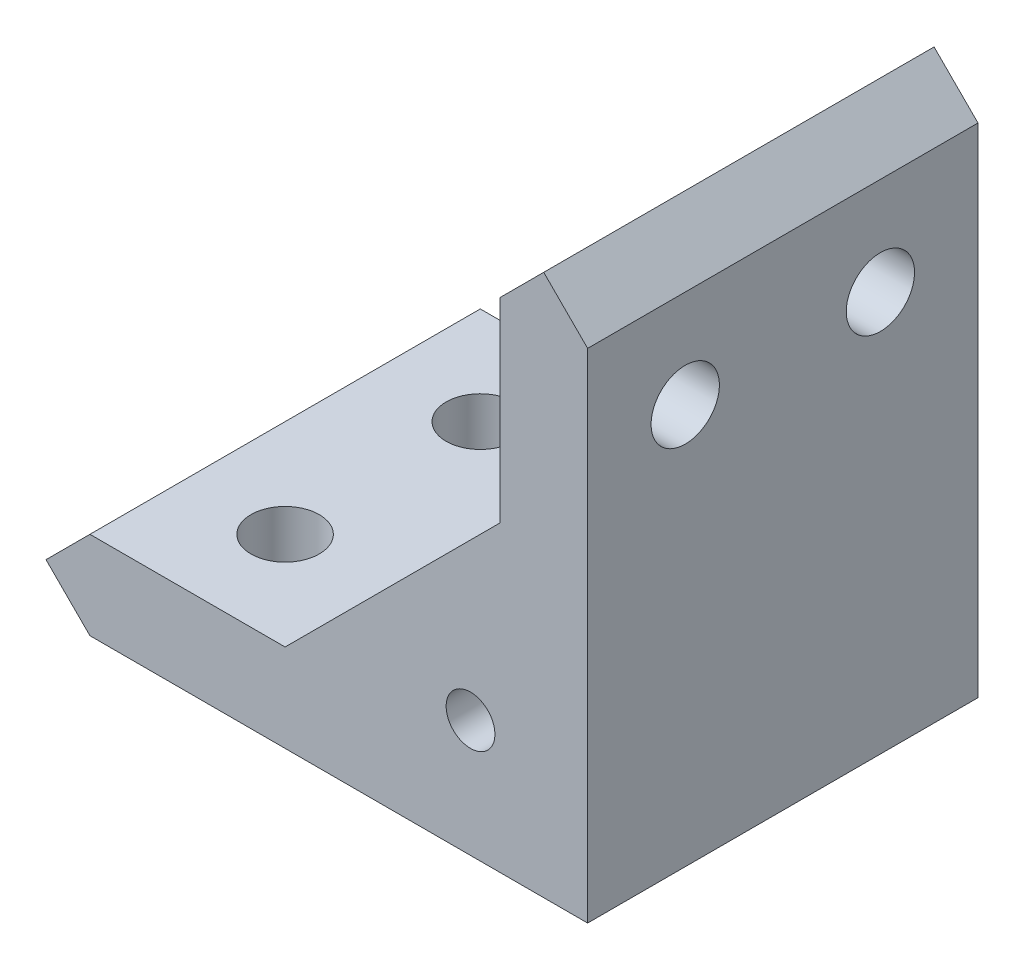
ISO-10303-21;
HEADER;
FILE_DESCRIPTION(('STEP AP214'),'2;1');
FILE_NAME('part.step','',(''),(''),'','','');
FILE_SCHEMA(('AUTOMOTIVE_DESIGN { 1 0 10303 214 1 1 1 1 }'));
ENDSEC;
DATA;
#1=APPLICATION_CONTEXT('core data for automotive mechanical design processes');
#2=APPLICATION_PROTOCOL_DEFINITION('international standard','automotive_design',2000,#1);
#3=PRODUCT_CONTEXT('',#1,'mechanical');
#4=PRODUCT('Part','Part','',(#3));
#5=PRODUCT_RELATED_PRODUCT_CATEGORY('part','',(#4));
#6=PRODUCT_DEFINITION_FORMATION('','',#4);
#7=PRODUCT_DEFINITION_CONTEXT('part definition',#1,'design');
#8=PRODUCT_DEFINITION('design','',#6,#7);
#9=PRODUCT_DEFINITION_SHAPE('','',#8);
#10=(LENGTH_UNIT() NAMED_UNIT(*) SI_UNIT(.MILLI.,.METRE.));
#11=(NAMED_UNIT(*) PLANE_ANGLE_UNIT() SI_UNIT($,.RADIAN.));
#12=(NAMED_UNIT(*) SI_UNIT($,.STERADIAN.) SOLID_ANGLE_UNIT());
#13=UNCERTAINTY_MEASURE_WITH_UNIT(LENGTH_MEASURE(1.E-05),#10,'distance_accuracy_value','');
#14=(GEOMETRIC_REPRESENTATION_CONTEXT(3) GLOBAL_UNCERTAINTY_ASSIGNED_CONTEXT((#13)) GLOBAL_UNIT_ASSIGNED_CONTEXT((#10,
#11,#12)) REPRESENTATION_CONTEXT('',''));
#15=CARTESIAN_POINT('',(0.,0.,0.));
#16=DIRECTION('',(0.,0.,1.));
#17=DIRECTION('',(1.,0.,0.));
#18=AXIS2_PLACEMENT_3D('',#15,#16,#17);
#19=CARTESIAN_POINT('',(-9.,31.,40.));
#20=DIRECTION('',(1.,0.,0.));
#21=DIRECTION('',(0.,0.,-1.));
#22=AXIS2_PLACEMENT_3D('',#19,#20,#21);
#23=PLANE('',#22);
#24=CARTESIAN_POINT('',(-9.,41.,30.));
#25=DIRECTION('',(-1.,0.,0.));
#26=DIRECTION('',(0.,0.,1.));
#27=AXIS2_PLACEMENT_3D('',#24,#25,#26);
#28=CIRCLE('',#27,3.5);
#29=CARTESIAN_POINT('',(-9.,41.,33.5));
#30=VERTEX_POINT('',#29);
#31=EDGE_CURVE('E156',#30,#30,#28,.T.);
#32=ORIENTED_EDGE('',*,*,#31,.F.);
#33=EDGE_LOOP('',(#32));
#34=FACE_BOUND('',#33,.T.);
#35=CARTESIAN_POINT('',(-9.,41.,10.));
#36=DIRECTION('',(-1.,0.,0.));
#37=DIRECTION('',(0.,0.,1.));
#38=AXIS2_PLACEMENT_3D('',#35,#36,#37);
#39=CIRCLE('',#38,3.5);
#40=CARTESIAN_POINT('',(-9.,41.,13.5));
#41=VERTEX_POINT('',#40);
#42=EDGE_CURVE('E204',#41,#41,#39,.T.);
#43=ORIENTED_EDGE('',*,*,#42,.F.);
#44=EDGE_LOOP('',(#43));
#45=FACE_BOUND('',#44,.T.);
#46=DIRECTION('',(0.,-1.,0.));
#47=VECTOR('',#46,1.);
#48=CARTESIAN_POINT('',(-9.,31.,40.));
#49=LINE('',#48,#47);
#50=CARTESIAN_POINT('',(-9.,51.,40.));
#51=VERTEX_POINT('',#50);
#52=CARTESIAN_POINT('',(-9.,31.,40.));
#53=VERTEX_POINT('',#52);
#54=EDGE_CURVE('E106',#51,#53,#49,.T.);
#55=ORIENTED_EDGE('',*,*,#54,.F.);
#56=DIRECTION('',(0.,0.,-1.));
#57=VECTOR('',#56,1.);
#58=CARTESIAN_POINT('',(-9.,51.,40.));
#59=LINE('',#58,#57);
#60=CARTESIAN_POINT('',(-9.,51.,0.));
#61=VERTEX_POINT('',#60);
#62=EDGE_CURVE('E11',#51,#61,#59,.T.);
#63=ORIENTED_EDGE('',*,*,#62,.T.);
#64=DIRECTION('',(0.,-1.,0.));
#65=VECTOR('',#64,1.);
#66=CARTESIAN_POINT('',(-9.,31.,0.));
#67=LINE('',#66,#65);
#68=CARTESIAN_POINT('',(-9.,31.,0.));
#69=VERTEX_POINT('',#68);
#70=EDGE_CURVE('E120',#61,#69,#67,.T.);
#71=ORIENTED_EDGE('',*,*,#70,.T.);
#72=DIRECTION('',(0.,0.,-1.));
#73=VECTOR('',#72,1.);
#74=CARTESIAN_POINT('',(-9.,31.,40.));
#75=LINE('',#74,#73);
#76=EDGE_CURVE('E118',#53,#69,#75,.T.);
#77=ORIENTED_EDGE('',*,*,#76,.F.);
#78=EDGE_LOOP('',(#55,#63,#71,#77));
#79=FACE_BOUND('',#78,.T.);
#80=ADVANCED_FACE('F36',(#34,#45,#79),#23,.F.);
#81=CARTESIAN_POINT('',(-31.,8.99999999999999,40.));
#82=DIRECTION('',(0.707106781186548,-0.707106781186548,0.));
#83=DIRECTION('',(0.707106781186548,0.707106781186548,0.));
#84=AXIS2_PLACEMENT_3D('',#81,#82,#83);
#85=PLANE('',#84);
#86=DIRECTION('',(-0.707106781186548,-0.707106781186548,0.));
#87=VECTOR('',#86,1.);
#88=CARTESIAN_POINT('',(-31.,8.99999999999999,0.));
#89=LINE('',#88,#87);
#90=CARTESIAN_POINT('',(-31.,8.99999999999999,0.));
#91=VERTEX_POINT('',#90);
#92=EDGE_CURVE('E140',#69,#91,#89,.T.);
#93=ORIENTED_EDGE('',*,*,#92,.T.);
#94=DIRECTION('',(0.,0.,-1.));
#95=VECTOR('',#94,1.);
#96=CARTESIAN_POINT('',(-31.,8.99999999999999,40.));
#97=LINE('',#96,#95);
#98=CARTESIAN_POINT('',(-31.,8.99999999999999,40.));
#99=VERTEX_POINT('',#98);
#100=EDGE_CURVE('E124',#99,#91,#97,.T.);
#101=ORIENTED_EDGE('',*,*,#100,.F.);
#102=DIRECTION('',(-0.707106781186548,-0.707106781186548,0.));
#103=VECTOR('',#102,1.);
#104=CARTESIAN_POINT('',(-31.,8.99999999999999,40.));
#105=LINE('',#104,#103);
#106=EDGE_CURVE('E110',#53,#99,#105,.T.);
#107=ORIENTED_EDGE('',*,*,#106,.F.);
#108=ORIENTED_EDGE('',*,*,#76,.T.);
#109=EDGE_LOOP('',(#93,#101,#107,#108));
#110=FACE_BOUND('',#109,.T.);
#111=ADVANCED_FACE('F126',(#110),#85,.F.);
#112=CARTESIAN_POINT('',(-56.,8.99999999999999,40.));
#113=DIRECTION('',(0.,-1.,0.));
#114=DIRECTION('',(0.,0.,-1.));
#115=AXIS2_PLACEMENT_3D('',#112,#113,#114);
#116=PLANE('',#115);
#117=CARTESIAN_POINT('',(-41.,8.99999999999999,30.));
#118=DIRECTION('',(0.,1.,0.));
#119=DIRECTION('',(0.,0.,1.));
#120=AXIS2_PLACEMENT_3D('',#117,#118,#119);
#121=CIRCLE('',#120,3.5);
#122=CARTESIAN_POINT('',(-41.,8.99999999999999,33.5));
#123=VERTEX_POINT('',#122);
#124=EDGE_CURVE('E161',#123,#123,#121,.T.);
#125=ORIENTED_EDGE('',*,*,#124,.F.);
#126=EDGE_LOOP('',(#125));
#127=FACE_BOUND('',#126,.T.);
#128=CARTESIAN_POINT('',(-41.,8.99999999999999,10.));
#129=DIRECTION('',(0.,1.,0.));
#130=DIRECTION('',(0.,0.,1.));
#131=AXIS2_PLACEMENT_3D('',#128,#129,#130);
#132=CIRCLE('',#131,3.5);
#133=CARTESIAN_POINT('',(-41.,8.99999999999999,13.5));
#134=VERTEX_POINT('',#133);
#135=EDGE_CURVE('E157',#134,#134,#132,.T.);
#136=ORIENTED_EDGE('',*,*,#135,.F.);
#137=EDGE_LOOP('',(#136));
#138=FACE_BOUND('',#137,.T.);
#139=DIRECTION('',(-1.,0.,0.));
#140=VECTOR('',#139,1.);
#141=CARTESIAN_POINT('',(-56.,8.99999999999999,0.));
#142=LINE('',#141,#140);
#143=CARTESIAN_POINT('',(-51.,8.99999999999999,0.));
#144=VERTEX_POINT('',#143);
#145=EDGE_CURVE('E143',#91,#144,#142,.T.);
#146=ORIENTED_EDGE('',*,*,#145,.T.);
#147=DIRECTION('',(0.,0.,1.));
#148=VECTOR('',#147,1.);
#149=CARTESIAN_POINT('',(-51.,8.99999999999999,40.));
#150=LINE('',#149,#148);
#151=CARTESIAN_POINT('',(-51.,8.99999999999999,40.));
#152=VERTEX_POINT('',#151);
#153=EDGE_CURVE('E177',#144,#152,#150,.T.);
#154=ORIENTED_EDGE('',*,*,#153,.T.);
#155=DIRECTION('',(-1.,0.,0.));
#156=VECTOR('',#155,1.);
#157=CARTESIAN_POINT('',(-56.,8.99999999999999,40.));
#158=LINE('',#157,#156);
#159=EDGE_CURVE('E129',#99,#152,#158,.T.);
#160=ORIENTED_EDGE('',*,*,#159,.F.);
#161=ORIENTED_EDGE('',*,*,#100,.T.);
#162=EDGE_LOOP('',(#146,#154,#160,#161));
#163=FACE_BOUND('',#162,.T.);
#164=ADVANCED_FACE('F219',(#127,#138,#163),#116,.F.);
#165=CARTESIAN_POINT('',(0.,0.,40.));
#166=DIRECTION('',(0.,1.,0.));
#167=DIRECTION('',(-1.,0.,0.));
#168=AXIS2_PLACEMENT_3D('',#165,#166,#167);
#169=PLANE('',#168);
#170=CARTESIAN_POINT('',(-41.,0.,30.));
#171=DIRECTION('',(0.,1.,0.));
#172=DIRECTION('',(-1.,0.,0.));
#173=AXIS2_PLACEMENT_3D('',#170,#171,#172);
#174=CIRCLE('',#173,3.5);
#175=CARTESIAN_POINT('',(-44.5,0.,30.));
#176=VERTEX_POINT('',#175);
#177=EDGE_CURVE('E158',#176,#176,#174,.T.);
#178=ORIENTED_EDGE('',*,*,#177,.T.);
#179=EDGE_LOOP('',(#178));
#180=FACE_BOUND('',#179,.T.);
#181=CARTESIAN_POINT('',(-41.,0.,10.));
#182=DIRECTION('',(0.,1.,0.));
#183=DIRECTION('',(-1.,0.,0.));
#184=AXIS2_PLACEMENT_3D('',#181,#182,#183);
#185=CIRCLE('',#184,3.5);
#186=CARTESIAN_POINT('',(-44.5,0.,10.));
#187=VERTEX_POINT('',#186);
#188=EDGE_CURVE('E153',#187,#187,#185,.T.);
#189=ORIENTED_EDGE('',*,*,#188,.T.);
#190=EDGE_LOOP('',(#189));
#191=FACE_BOUND('',#190,.T.);
#192=DIRECTION('',(1.,0.,0.));
#193=VECTOR('',#192,1.);
#194=CARTESIAN_POINT('',(0.,0.,40.));
#195=LINE('',#194,#193);
#196=CARTESIAN_POINT('',(-51.,0.,40.));
#197=VERTEX_POINT('',#196);
#198=CARTESIAN_POINT('',(0.,0.,40.));
#199=VERTEX_POINT('',#198);
#200=EDGE_CURVE('E131',#197,#199,#195,.T.);
#201=ORIENTED_EDGE('',*,*,#200,.F.);
#202=DIRECTION('',(0.,0.,-1.));
#203=VECTOR('',#202,1.);
#204=CARTESIAN_POINT('',(-51.,0.,40.));
#205=LINE('',#204,#203);
#206=CARTESIAN_POINT('',(-51.,0.,0.));
#207=VERTEX_POINT('',#206);
#208=EDGE_CURVE('E123',#197,#207,#205,.T.);
#209=ORIENTED_EDGE('',*,*,#208,.T.);
#210=DIRECTION('',(1.,0.,0.));
#211=VECTOR('',#210,1.);
#212=CARTESIAN_POINT('',(0.,0.,0.));
#213=LINE('',#212,#211);
#214=CARTESIAN_POINT('',(0.,0.,0.));
#215=VERTEX_POINT('',#214);
#216=EDGE_CURVE('E146',#207,#215,#213,.T.);
#217=ORIENTED_EDGE('',*,*,#216,.T.);
#218=DIRECTION('',(0.,0.,-1.));
#219=VECTOR('',#218,1.);
#220=CARTESIAN_POINT('',(0.,0.,40.));
#221=LINE('',#220,#219);
#222=EDGE_CURVE('E138',#199,#215,#221,.T.);
#223=ORIENTED_EDGE('',*,*,#222,.F.);
#224=EDGE_LOOP('',(#201,#209,#217,#223));
#225=FACE_BOUND('',#224,.T.);
#226=ADVANCED_FACE('F250',(#180,#191,#225),#169,.F.);
#227=CARTESIAN_POINT('',(0.,56.,40.));
#228=DIRECTION('',(-1.,0.,0.));
#229=DIRECTION('',(0.,-1.,0.));
#230=AXIS2_PLACEMENT_3D('',#227,#228,#229);
#231=PLANE('',#230);
#232=CARTESIAN_POINT('',(0.,41.,30.));
#233=DIRECTION('',(-1.,0.,0.));
#234=DIRECTION('',(0.,0.,1.));
#235=AXIS2_PLACEMENT_3D('',#232,#233,#234);
#236=CIRCLE('',#235,3.5);
#237=CARTESIAN_POINT('',(0.,41.,33.5));
#238=VERTEX_POINT('',#237);
#239=EDGE_CURVE('E201',#238,#238,#236,.T.);
#240=ORIENTED_EDGE('',*,*,#239,.T.);
#241=EDGE_LOOP('',(#240));
#242=FACE_BOUND('',#241,.T.);
#243=CARTESIAN_POINT('',(0.,41.,10.));
#244=DIRECTION('',(-1.,0.,0.));
#245=DIRECTION('',(0.,0.,1.));
#246=AXIS2_PLACEMENT_3D('',#243,#244,#245);
#247=CIRCLE('',#246,3.5);
#248=CARTESIAN_POINT('',(0.,41.,13.5));
#249=VERTEX_POINT('',#248);
#250=EDGE_CURVE('E141',#249,#249,#247,.T.);
#251=ORIENTED_EDGE('',*,*,#250,.T.);
#252=EDGE_LOOP('',(#251));
#253=FACE_BOUND('',#252,.T.);
#254=DIRECTION('',(0.,1.,0.));
#255=VECTOR('',#254,1.);
#256=CARTESIAN_POINT('',(0.,56.,0.));
#257=LINE('',#256,#255);
#258=CARTESIAN_POINT('',(0.,51.,0.));
#259=VERTEX_POINT('',#258);
#260=EDGE_CURVE('E115',#215,#259,#257,.T.);
#261=ORIENTED_EDGE('',*,*,#260,.T.);
#262=DIRECTION('',(0.,0.,1.));
#263=VECTOR('',#262,1.);
#264=CARTESIAN_POINT('',(0.,51.,40.));
#265=LINE('',#264,#263);
#266=CARTESIAN_POINT('',(0.,51.,40.));
#267=VERTEX_POINT('',#266);
#268=EDGE_CURVE('E45',#259,#267,#265,.T.);
#269=ORIENTED_EDGE('',*,*,#268,.T.);
#270=DIRECTION('',(0.,1.,0.));
#271=VECTOR('',#270,1.);
#272=CARTESIAN_POINT('',(0.,56.,40.));
#273=LINE('',#272,#271);
#274=EDGE_CURVE('E136',#199,#267,#273,.T.);
#275=ORIENTED_EDGE('',*,*,#274,.F.);
#276=ORIENTED_EDGE('',*,*,#222,.T.);
#277=EDGE_LOOP('',(#261,#269,#275,#276));
#278=FACE_BOUND('',#277,.T.);
#279=ADVANCED_FACE('F244',(#242,#253,#278),#231,.F.);
#280=CARTESIAN_POINT('',(0.,0.,40.));
#281=DIRECTION('',(0.,0.,-1.));
#282=DIRECTION('',(-1.,0.,0.));
#283=AXIS2_PLACEMENT_3D('',#280,#281,#282);
#284=PLANE('',#283);
#285=CARTESIAN_POINT('',(-12.,12.,40.));
#286=DIRECTION('',(0.,0.,-1.));
#287=DIRECTION('',(-1.,0.,0.));
#288=AXIS2_PLACEMENT_3D('',#285,#286,#287);
#289=CIRCLE('',#288,2.5);
#290=CARTESIAN_POINT('',(-14.5,12.,40.));
#291=VERTEX_POINT('',#290);
#292=EDGE_CURVE('E187',#291,#291,#289,.T.);
#293=ORIENTED_EDGE('',*,*,#292,.T.);
#294=EDGE_LOOP('',(#293));
#295=FACE_BOUND('',#294,.T.);
#296=DIRECTION('',(0.707106781186549,0.707106781186547,0.));
#297=VECTOR('',#296,1.);
#298=CARTESIAN_POINT('',(-56.,4.,40.));
#299=LINE('',#298,#297);
#300=CARTESIAN_POINT('',(-55.5,4.49999999999999,40.));
#301=VERTEX_POINT('',#300);
#302=EDGE_CURVE('E53',#152,#301,#299,.F.);
#303=ORIENTED_EDGE('',*,*,#302,.T.);
#304=DIRECTION('',(-0.70710678118655,0.707106781186546,0.));
#305=VECTOR('',#304,1.);
#306=CARTESIAN_POINT('',(-51.,0.,40.));
#307=LINE('',#306,#305);
#308=EDGE_CURVE('E175',#301,#197,#307,.F.);
#309=ORIENTED_EDGE('',*,*,#308,.T.);
#310=ORIENTED_EDGE('',*,*,#200,.T.);
#311=ORIENTED_EDGE('',*,*,#274,.T.);
#312=DIRECTION('',(0.707106781186547,-0.707106781186549,0.));
#313=VECTOR('',#312,1.);
#314=CARTESIAN_POINT('',(-4.99999999999999,56.,40.));
#315=LINE('',#314,#313);
#316=CARTESIAN_POINT('',(-4.49999999999998,55.5,40.));
#317=VERTEX_POINT('',#316);
#318=EDGE_CURVE('E60',#267,#317,#315,.F.);
#319=ORIENTED_EDGE('',*,*,#318,.T.);
#320=DIRECTION('',(0.707106781186549,0.707106781186546,0.));
#321=VECTOR('',#320,1.);
#322=CARTESIAN_POINT('',(-9.,51.,40.));
#323=LINE('',#322,#321);
#324=EDGE_CURVE('E112',#317,#51,#323,.F.);
#325=ORIENTED_EDGE('',*,*,#324,.T.);
#326=ORIENTED_EDGE('',*,*,#54,.T.);
#327=ORIENTED_EDGE('',*,*,#106,.T.);
#328=ORIENTED_EDGE('',*,*,#159,.T.);
#329=EDGE_LOOP('',(#303,#309,#310,#311,#319,#325,#326,#327,#328));
#330=FACE_BOUND('',#329,.T.);
#331=ADVANCED_FACE('F108',(#295,#330),#284,.F.);
#332=CARTESIAN_POINT('',(0.,0.,0.));
#333=DIRECTION('',(0.,0.,-1.));
#334=DIRECTION('',(-1.,0.,0.));
#335=AXIS2_PLACEMENT_3D('',#332,#333,#334);
#336=PLANE('',#335);
#337=CARTESIAN_POINT('',(-12.,12.,0.));
#338=DIRECTION('',(0.,0.,-1.));
#339=DIRECTION('',(-1.,0.,0.));
#340=AXIS2_PLACEMENT_3D('',#337,#338,#339);
#341=CIRCLE('',#340,2.5);
#342=CARTESIAN_POINT('',(-14.5,12.,0.));
#343=VERTEX_POINT('',#342);
#344=EDGE_CURVE('E192',#343,#343,#341,.T.);
#345=ORIENTED_EDGE('',*,*,#344,.F.);
#346=EDGE_LOOP('',(#345));
#347=FACE_BOUND('',#346,.T.);
#348=ORIENTED_EDGE('',*,*,#216,.F.);
#349=DIRECTION('',(0.70710678118655,-0.707106781186546,0.));
#350=VECTOR('',#349,1.);
#351=CARTESIAN_POINT('',(-25.4999999999999,-25.5,0.));
#352=LINE('',#351,#350);
#353=CARTESIAN_POINT('',(-55.5,4.49999999999998,0.));
#354=VERTEX_POINT('',#353);
#355=EDGE_CURVE('E170',#207,#354,#352,.F.);
#356=ORIENTED_EDGE('',*,*,#355,.T.);
#357=DIRECTION('',(-0.707106781186549,-0.707106781186547,0.));
#358=VECTOR('',#357,1.);
#359=CARTESIAN_POINT('',(-29.9999999999999,30.,0.));
#360=LINE('',#359,#358);
#361=EDGE_CURVE('E168',#354,#144,#360,.F.);
#362=ORIENTED_EDGE('',*,*,#361,.T.);
#363=ORIENTED_EDGE('',*,*,#145,.F.);
#364=ORIENTED_EDGE('',*,*,#92,.F.);
#365=ORIENTED_EDGE('',*,*,#70,.F.);
#366=DIRECTION('',(-0.707106781186549,-0.707106781186546,0.));
#367=VECTOR('',#366,1.);
#368=CARTESIAN_POINT('',(-30.,30.0000000000001,0.));
#369=LINE('',#368,#367);
#370=CARTESIAN_POINT('',(-4.49999999999998,55.5,0.));
#371=VERTEX_POINT('',#370);
#372=EDGE_CURVE('E164',#61,#371,#369,.F.);
#373=ORIENTED_EDGE('',*,*,#372,.T.);
#374=DIRECTION('',(-0.707106781186547,0.707106781186549,0.));
#375=VECTOR('',#374,1.);
#376=CARTESIAN_POINT('',(25.5,25.4999999999999,0.));
#377=LINE('',#376,#375);
#378=EDGE_CURVE('E166',#371,#259,#377,.F.);
#379=ORIENTED_EDGE('',*,*,#378,.T.);
#380=ORIENTED_EDGE('',*,*,#260,.F.);
#381=EDGE_LOOP('',(#348,#356,#362,#363,#364,#365,#373,#379,#380));
#382=FACE_BOUND('',#381,.T.);
#383=ADVANCED_FACE('F253',(#347,#382),#336,.T.);
#384=CARTESIAN_POINT('',(0.,41.,10.));
#385=DIRECTION('',(-1.,0.,0.));
#386=DIRECTION('',(0.,0.,1.));
#387=AXIS2_PLACEMENT_3D('',#384,#385,#386);
#388=CYLINDRICAL_SURFACE('',#387,3.5);
#389=ORIENTED_EDGE('',*,*,#250,.F.);
#390=EDGE_LOOP('',(#389));
#391=FACE_BOUND('',#390,.T.);
#392=ORIENTED_EDGE('',*,*,#42,.T.);
#393=EDGE_LOOP('',(#392));
#394=FACE_BOUND('',#393,.T.);
#395=ADVANCED_FACE('F211',(#391,#394),#388,.F.);
#396=CARTESIAN_POINT('',(0.,41.,30.));
#397=DIRECTION('',(-1.,0.,0.));
#398=DIRECTION('',(0.,0.,1.));
#399=AXIS2_PLACEMENT_3D('',#396,#397,#398);
#400=CYLINDRICAL_SURFACE('',#399,3.5);
#401=ORIENTED_EDGE('',*,*,#239,.F.);
#402=EDGE_LOOP('',(#401));
#403=FACE_BOUND('',#402,.T.);
#404=ORIENTED_EDGE('',*,*,#31,.T.);
#405=EDGE_LOOP('',(#404));
#406=FACE_BOUND('',#405,.T.);
#407=ADVANCED_FACE('F279',(#403,#406),#400,.F.);
#408=CARTESIAN_POINT('',(-41.,-31.,10.));
#409=DIRECTION('',(0.,1.,0.));
#410=DIRECTION('',(0.,0.,1.));
#411=AXIS2_PLACEMENT_3D('',#408,#409,#410);
#412=CYLINDRICAL_SURFACE('',#411,3.5);
#413=ORIENTED_EDGE('',*,*,#135,.T.);
#414=EDGE_LOOP('',(#413));
#415=FACE_BOUND('',#414,.T.);
#416=ORIENTED_EDGE('',*,*,#188,.F.);
#417=EDGE_LOOP('',(#416));
#418=FACE_BOUND('',#417,.T.);
#419=ADVANCED_FACE('F283',(#415,#418),#412,.F.);
#420=CARTESIAN_POINT('',(-41.,-31.,30.));
#421=DIRECTION('',(0.,1.,0.));
#422=DIRECTION('',(0.,0.,1.));
#423=AXIS2_PLACEMENT_3D('',#420,#421,#422);
#424=CYLINDRICAL_SURFACE('',#423,3.5);
#425=ORIENTED_EDGE('',*,*,#124,.T.);
#426=EDGE_LOOP('',(#425));
#427=FACE_BOUND('',#426,.T.);
#428=ORIENTED_EDGE('',*,*,#177,.F.);
#429=EDGE_LOOP('',(#428));
#430=FACE_BOUND('',#429,.T.);
#431=ADVANCED_FACE('F229',(#427,#430),#424,.F.);
#432=CARTESIAN_POINT('',(-56.,4.,40.));
#433=DIRECTION('',(0.707106781186546,-0.707106781186548,0.));
#434=DIRECTION('',(0.,0.,-1.));
#435=AXIS2_PLACEMENT_3D('',#432,#433,#434);
#436=PLANE('',#435);
#437=DIRECTION('',(0.,0.,-1.));
#438=VECTOR('',#437,1.);
#439=CARTESIAN_POINT('',(-55.5,4.49999999999999,40.));
#440=LINE('',#439,#438);
#441=EDGE_CURVE('E180',#301,#354,#440,.T.);
#442=ORIENTED_EDGE('',*,*,#441,.F.);
#443=ORIENTED_EDGE('',*,*,#302,.F.);
#444=ORIENTED_EDGE('',*,*,#153,.F.);
#445=ORIENTED_EDGE('',*,*,#361,.F.);
#446=EDGE_LOOP('',(#442,#443,#444,#445));
#447=FACE_BOUND('',#446,.T.);
#448=ADVANCED_FACE('F227',(#447),#436,.F.);
#449=CARTESIAN_POINT('',(-51.,0.,40.));
#450=DIRECTION('',(0.707106781186545,0.707106781186549,0.));
#451=DIRECTION('',(0.,0.,-1.));
#452=AXIS2_PLACEMENT_3D('',#449,#450,#451);
#453=PLANE('',#452);
#454=ORIENTED_EDGE('',*,*,#308,.F.);
#455=ORIENTED_EDGE('',*,*,#441,.T.);
#456=ORIENTED_EDGE('',*,*,#355,.F.);
#457=ORIENTED_EDGE('',*,*,#208,.F.);
#458=EDGE_LOOP('',(#454,#455,#456,#457));
#459=FACE_BOUND('',#458,.T.);
#460=ADVANCED_FACE('F224',(#459),#453,.F.);
#461=CARTESIAN_POINT('',(-9.,51.,40.));
#462=DIRECTION('',(0.707106781186545,-0.707106781186549,0.));
#463=DIRECTION('',(0.,0.,-1.));
#464=AXIS2_PLACEMENT_3D('',#461,#462,#463);
#465=PLANE('',#464);
#466=ORIENTED_EDGE('',*,*,#62,.F.);
#467=ORIENTED_EDGE('',*,*,#324,.F.);
#468=DIRECTION('',(0.,0.,1.));
#469=VECTOR('',#468,1.);
#470=CARTESIAN_POINT('',(-4.49999999999998,55.5,40.));
#471=LINE('',#470,#469);
#472=EDGE_CURVE('E40',#371,#317,#471,.T.);
#473=ORIENTED_EDGE('',*,*,#472,.F.);
#474=ORIENTED_EDGE('',*,*,#372,.F.);
#475=EDGE_LOOP('',(#466,#467,#473,#474));
#476=FACE_BOUND('',#475,.T.);
#477=ADVANCED_FACE('F38',(#476),#465,.F.);
#478=CARTESIAN_POINT('',(-4.99999999999999,56.,40.));
#479=DIRECTION('',(-0.707106781186548,-0.707106781186546,0.));
#480=DIRECTION('',(0.,0.,-1.));
#481=AXIS2_PLACEMENT_3D('',#478,#479,#480);
#482=PLANE('',#481);
#483=ORIENTED_EDGE('',*,*,#318,.F.);
#484=ORIENTED_EDGE('',*,*,#268,.F.);
#485=ORIENTED_EDGE('',*,*,#378,.F.);
#486=ORIENTED_EDGE('',*,*,#472,.T.);
#487=EDGE_LOOP('',(#483,#484,#485,#486));
#488=FACE_BOUND('',#487,.T.);
#489=ADVANCED_FACE('F231',(#488),#482,.F.);
#490=CARTESIAN_POINT('',(-12.,12.,40.));
#491=DIRECTION('',(0.,0.,-1.));
#492=DIRECTION('',(-1.,0.,0.));
#493=AXIS2_PLACEMENT_3D('',#490,#491,#492);
#494=CYLINDRICAL_SURFACE('',#493,2.5);
#495=ORIENTED_EDGE('',*,*,#292,.F.);
#496=EDGE_LOOP('',(#495));
#497=FACE_BOUND('',#496,.T.);
#498=ORIENTED_EDGE('',*,*,#344,.T.);
#499=EDGE_LOOP('',(#498));
#500=FACE_BOUND('',#499,.T.);
#501=ADVANCED_FACE('F233',(#497,#500),#494,.F.);
#502=CLOSED_SHELL('',(#80,#111,#164,#226,#279,#331,#383,#395,#407,#419,#431,#448,#460,#477,#489,#501));
#503=MANIFOLD_SOLID_BREP('B2',#502);
#504=ADVANCED_BREP_SHAPE_REPRESENTATION('',(#18,#503),#14);
#505=SHAPE_DEFINITION_REPRESENTATION(#9,#504);
ENDSEC;
END-ISO-10303-21;
